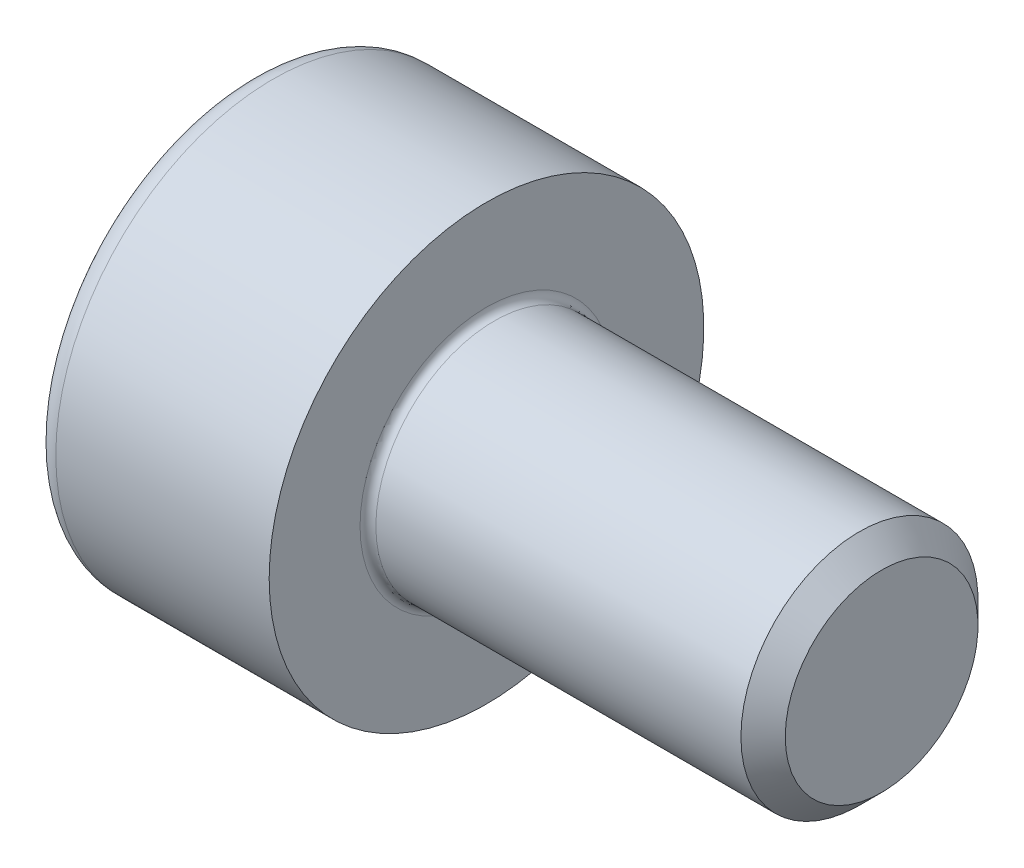
ISO-10303-21;
HEADER;
FILE_DESCRIPTION(('STEP AP214'),'2;1');
FILE_NAME('part.step','',(''),(''),'','','');
FILE_SCHEMA(('AUTOMOTIVE_DESIGN { 1 0 10303 214 1 1 1 1 }'));
ENDSEC;
DATA;
#1=APPLICATION_CONTEXT('core data for automotive mechanical design processes');
#2=APPLICATION_PROTOCOL_DEFINITION('international standard','automotive_design',2000,#1);
#3=PRODUCT_CONTEXT('',#1,'mechanical');
#4=PRODUCT('Part','Part','',(#3));
#5=PRODUCT_RELATED_PRODUCT_CATEGORY('part','',(#4));
#6=PRODUCT_DEFINITION_FORMATION('','',#4);
#7=PRODUCT_DEFINITION_CONTEXT('part definition',#1,'design');
#8=PRODUCT_DEFINITION('design','',#6,#7);
#9=PRODUCT_DEFINITION_SHAPE('','',#8);
#10=(LENGTH_UNIT() NAMED_UNIT(*) SI_UNIT(.MILLI.,.METRE.));
#11=(NAMED_UNIT(*) PLANE_ANGLE_UNIT() SI_UNIT($,.RADIAN.));
#12=(NAMED_UNIT(*) SI_UNIT($,.STERADIAN.) SOLID_ANGLE_UNIT());
#13=UNCERTAINTY_MEASURE_WITH_UNIT(LENGTH_MEASURE(1.E-05),#10,'distance_accuracy_value','');
#14=(GEOMETRIC_REPRESENTATION_CONTEXT(3) GLOBAL_UNCERTAINTY_ASSIGNED_CONTEXT((#13)) GLOBAL_UNIT_ASSIGNED_CONTEXT((#10,
#11,#12)) REPRESENTATION_CONTEXT('',''));
#15=CARTESIAN_POINT('',(0.,0.,0.));
#16=DIRECTION('',(0.,0.,1.));
#17=DIRECTION('',(1.,0.,0.));
#18=AXIS2_PLACEMENT_3D('',#15,#16,#17);
#19=CARTESIAN_POINT('',(8.,1.2195,0.));
#20=DIRECTION('',(1.,0.,0.));
#21=DIRECTION('',(0.,0.,-1.));
#22=AXIS2_PLACEMENT_3D('',#19,#20,#21);
#23=PLANE('',#22);
#24=CARTESIAN_POINT('',(7.99999999998136,0.,0.));
#25=DIRECTION('',(-1.,0.,0.));
#26=DIRECTION('',(0.,0.,1.));
#27=AXIS2_PLACEMENT_3D('',#24,#25,#26);
#28=CIRCLE('',#27,1.21950000004745);
#29=CARTESIAN_POINT('',(7.99999999998136,0.,1.21950000004745));
#30=VERTEX_POINT('',#29);
#31=EDGE_CURVE('E107',#30,#30,#28,.T.);
#32=ORIENTED_EDGE('',*,*,#31,.F.);
#33=EDGE_LOOP('',(#32));
#34=FACE_BOUND('',#33,.T.);
#35=ADVANCED_FACE('F16',(#34),#23,.T.);
#36=CARTESIAN_POINT('',(1.30000000012842,0.,0.));
#37=DIRECTION('',(-1.,0.,0.));
#38=DIRECTION('',(0.,0.,1.));
#39=AXIS2_PLACEMENT_3D('',#36,#37,#38);
#40=CONICAL_SURFACE('',#39,1.25999999988835,1.04719755097185);
#41=CARTESIAN_POINT('',(2.02746133933829,0.,2.27373675443232E-10));
#42=VERTEX_POINT('',#41);
#43=VERTEX_LOOP('',#42);
#44=FACE_BOUND('',#43,.T.);
#45=CARTESIAN_POINT('',(1.30000000002996,0.,0.));
#46=DIRECTION('',(-1.,0.,0.));
#47=DIRECTION('',(0.,0.,1.));
#48=AXIS2_PLACEMENT_3D('',#45,#46,#47);
#49=CIRCLE('',#48,1.26000000005888);
#50=CARTESIAN_POINT('',(1.30000000001498,-1.09119200879389,0.630000000014723));
#51=VERTEX_POINT('',#50);
#52=CARTESIAN_POINT('',(1.30000000001498,0.,1.26000000002944));
#53=VERTEX_POINT('',#52);
#54=EDGE_CURVE('E96',#51,#53,#49,.T.);
#55=ORIENTED_EDGE('',*,*,#54,.T.);
#56=CARTESIAN_POINT('',(1.30000000002996,0.,0.));
#57=DIRECTION('',(-1.,0.,0.));
#58=DIRECTION('',(0.,0.,1.));
#59=AXIS2_PLACEMENT_3D('',#56,#57,#58);
#60=CIRCLE('',#59,1.26000000005888);
#61=CARTESIAN_POINT('',(1.30000000001498,1.09119200879389,0.63000000001472));
#62=VERTEX_POINT('',#61);
#63=EDGE_CURVE('E99',#53,#62,#60,.T.);
#64=ORIENTED_EDGE('',*,*,#63,.T.);
#65=CARTESIAN_POINT('',(1.30000000002996,0.,0.));
#66=DIRECTION('',(-1.,0.,0.));
#67=DIRECTION('',(0.,0.,1.));
#68=AXIS2_PLACEMENT_3D('',#65,#66,#67);
#69=CIRCLE('',#68,1.26000000005888);
#70=CARTESIAN_POINT('',(1.30000000001498,1.09119200879389,-0.630000000014721));
#71=VERTEX_POINT('',#70);
#72=EDGE_CURVE('E102',#62,#71,#69,.T.);
#73=ORIENTED_EDGE('',*,*,#72,.T.);
#74=CARTESIAN_POINT('',(1.30000000002996,0.,0.));
#75=DIRECTION('',(-1.,0.,0.));
#76=DIRECTION('',(0.,0.,1.));
#77=AXIS2_PLACEMENT_3D('',#74,#75,#76);
#78=CIRCLE('',#77,1.26000000005888);
#79=CARTESIAN_POINT('',(1.30000000001498,0.,-1.26000000002944));
#80=VERTEX_POINT('',#79);
#81=EDGE_CURVE('E117',#71,#80,#78,.T.);
#82=ORIENTED_EDGE('',*,*,#81,.T.);
#83=CARTESIAN_POINT('',(1.30000000002996,0.,0.));
#84=DIRECTION('',(-1.,0.,0.));
#85=DIRECTION('',(0.,0.,1.));
#86=AXIS2_PLACEMENT_3D('',#83,#84,#85);
#87=CIRCLE('',#86,1.26000000005888);
#88=CARTESIAN_POINT('',(1.30000000001498,-1.09119200879389,-0.630000000014722));
#89=VERTEX_POINT('',#88);
#90=EDGE_CURVE('E118',#80,#89,#87,.T.);
#91=ORIENTED_EDGE('',*,*,#90,.T.);
#92=CARTESIAN_POINT('',(1.30000000002996,0.,0.));
#93=DIRECTION('',(-1.,0.,0.));
#94=DIRECTION('',(0.,0.,1.));
#95=AXIS2_PLACEMENT_3D('',#92,#93,#94);
#96=CIRCLE('',#95,1.26000000005888);
#97=EDGE_CURVE('E225',#89,#51,#96,.T.);
#98=ORIENTED_EDGE('',*,*,#97,.T.);
#99=EDGE_LOOP('',(#55,#64,#73,#82,#91,#98));
#100=FACE_BOUND('',#99,.T.);
#101=ADVANCED_FACE('F101',(#44,#100),#40,.F.);
#102=CARTESIAN_POINT('',(7.71950000006427,0.,0.));
#103=DIRECTION('',(-1.,0.,0.));
#104=DIRECTION('',(0.,0.,1.));
#105=AXIS2_PLACEMENT_3D('',#102,#103,#104);
#106=CONICAL_SURFACE('',#105,1.49999999996453,0.785398163397448);
#107=CARTESIAN_POINT('',(7.7195,0.,0.));
#108=DIRECTION('',(-1.,0.,0.));
#109=DIRECTION('',(0.,0.,1.));
#110=AXIS2_PLACEMENT_3D('',#107,#108,#109);
#111=CIRCLE('',#110,1.5);
#112=CARTESIAN_POINT('',(7.7195,0.,1.5));
#113=VERTEX_POINT('',#112);
#114=EDGE_CURVE('E132',#113,#113,#111,.T.);
#115=ORIENTED_EDGE('',*,*,#114,.F.);
#116=EDGE_LOOP('',(#115));
#117=FACE_BOUND('',#116,.T.);
#118=ORIENTED_EDGE('',*,*,#31,.T.);
#119=EDGE_LOOP('',(#118));
#120=FACE_BOUND('',#119,.T.);
#121=ADVANCED_FACE('F515',(#117,#120),#106,.T.);
#122=CARTESIAN_POINT('',(1.3,1.45492267835785,0.));
#123=DIRECTION('',(1.,0.,0.));
#124=DIRECTION('',(0.,0.,-1.));
#125=AXIS2_PLACEMENT_3D('',#122,#123,#124);
#126=PLANE('',#125);
#127=DIRECTION('',(0.,0.5,-0.866025403784439));
#128=VECTOR('',#127,1.);
#129=CARTESIAN_POINT('',(1.3,1.45492267835785,0.));
#130=LINE('',#129,#128);
#131=CARTESIAN_POINT('',(1.3,0.727461339178924,1.26));
#132=VERTEX_POINT('',#131);
#133=EDGE_CURVE('E121',#62,#132,#130,.F.);
#134=ORIENTED_EDGE('',*,*,#133,.F.);
#135=ORIENTED_EDGE('',*,*,#63,.F.);
#136=DIRECTION('',(0.,-1.,0.));
#137=VECTOR('',#136,1.);
#138=CARTESIAN_POINT('',(1.3,-0.727461339178934,1.26));
#139=LINE('',#138,#137);
#140=EDGE_CURVE('E123',#53,#132,#139,.F.);
#141=ORIENTED_EDGE('',*,*,#140,.T.);
#142=EDGE_LOOP('',(#134,#135,#141));
#143=FACE_BOUND('',#142,.T.);
#144=ADVANCED_FACE('F122',(#143),#126,.F.);
#145=CARTESIAN_POINT('',(1.3,1.45492267835785,0.));
#146=DIRECTION('',(1.,0.,0.));
#147=DIRECTION('',(0.,0.,-1.));
#148=AXIS2_PLACEMENT_3D('',#145,#146,#147);
#149=PLANE('',#148);
#150=DIRECTION('',(0.,-1.,0.));
#151=VECTOR('',#150,1.);
#152=CARTESIAN_POINT('',(1.3,-0.727461339178934,1.26));
#153=LINE('',#152,#151);
#154=CARTESIAN_POINT('',(1.3,-0.727461339178934,1.26));
#155=VERTEX_POINT('',#154);
#156=EDGE_CURVE('E127',#155,#53,#153,.F.);
#157=ORIENTED_EDGE('',*,*,#156,.T.);
#158=ORIENTED_EDGE('',*,*,#54,.F.);
#159=DIRECTION('',(0.,0.500000000000001,0.866025403784438));
#160=VECTOR('',#159,1.);
#161=CARTESIAN_POINT('',(1.3,-0.727461339178934,1.26));
#162=LINE('',#161,#160);
#163=EDGE_CURVE('E182',#155,#51,#162,.F.);
#164=ORIENTED_EDGE('',*,*,#163,.F.);
#165=EDGE_LOOP('',(#157,#158,#164));
#166=FACE_BOUND('',#165,.T.);
#167=ADVANCED_FACE('F371',(#166),#149,.F.);
#168=CARTESIAN_POINT('',(1.3,1.45492267835785,0.));
#169=DIRECTION('',(1.,0.,0.));
#170=DIRECTION('',(0.,0.,-1.));
#171=AXIS2_PLACEMENT_3D('',#168,#169,#170);
#172=PLANE('',#171);
#173=DIRECTION('',(0.,0.500000000000001,0.866025403784438));
#174=VECTOR('',#173,1.);
#175=CARTESIAN_POINT('',(1.3,-0.727461339178934,1.26));
#176=LINE('',#175,#174);
#177=CARTESIAN_POINT('',(1.3,-1.45492267835786,0.));
#178=VERTEX_POINT('',#177);
#179=EDGE_CURVE('E178',#51,#178,#176,.F.);
#180=ORIENTED_EDGE('',*,*,#179,.F.);
#181=ORIENTED_EDGE('',*,*,#97,.F.);
#182=DIRECTION('',(0.,-0.5,0.866025403784439));
#183=VECTOR('',#182,1.);
#184=CARTESIAN_POINT('',(1.3,-1.45492267835786,0.));
#185=LINE('',#184,#183);
#186=EDGE_CURVE('E164',#178,#89,#185,.F.);
#187=ORIENTED_EDGE('',*,*,#186,.F.);
#188=EDGE_LOOP('',(#180,#181,#187));
#189=FACE_BOUND('',#188,.T.);
#190=ADVANCED_FACE('F366',(#189),#172,.F.);
#191=CARTESIAN_POINT('',(1.3,1.45492267835785,0.));
#192=DIRECTION('',(1.,0.,0.));
#193=DIRECTION('',(0.,0.,-1.));
#194=AXIS2_PLACEMENT_3D('',#191,#192,#193);
#195=PLANE('',#194);
#196=DIRECTION('',(0.,-0.5,0.866025403784439));
#197=VECTOR('',#196,1.);
#198=CARTESIAN_POINT('',(1.3,-1.45492267835786,0.));
#199=LINE('',#198,#197);
#200=CARTESIAN_POINT('',(1.3,-0.727461339178936,-1.26));
#201=VERTEX_POINT('',#200);
#202=EDGE_CURVE('E161',#89,#201,#199,.F.);
#203=ORIENTED_EDGE('',*,*,#202,.F.);
#204=ORIENTED_EDGE('',*,*,#90,.F.);
#205=DIRECTION('',(0.,1.,0.));
#206=VECTOR('',#205,1.);
#207=CARTESIAN_POINT('',(1.3,0.727461339178922,-1.26));
#208=LINE('',#207,#206);
#209=EDGE_CURVE('E155',#80,#201,#208,.F.);
#210=ORIENTED_EDGE('',*,*,#209,.T.);
#211=EDGE_LOOP('',(#203,#204,#210));
#212=FACE_BOUND('',#211,.T.);
#213=ADVANCED_FACE('F361',(#212),#195,.F.);
#214=CARTESIAN_POINT('',(1.3,1.45492267835785,0.));
#215=DIRECTION('',(1.,0.,0.));
#216=DIRECTION('',(0.,0.,-1.));
#217=AXIS2_PLACEMENT_3D('',#214,#215,#216);
#218=PLANE('',#217);
#219=DIRECTION('',(0.,0.500000000000001,0.866025403784438));
#220=VECTOR('',#219,1.);
#221=CARTESIAN_POINT('',(1.3,1.45492267835785,0.));
#222=LINE('',#221,#220);
#223=CARTESIAN_POINT('',(1.3,1.45492267835785,0.));
#224=VERTEX_POINT('',#223);
#225=EDGE_CURVE('E115',#224,#71,#222,.F.);
#226=ORIENTED_EDGE('',*,*,#225,.T.);
#227=ORIENTED_EDGE('',*,*,#72,.F.);
#228=DIRECTION('',(0.,0.5,-0.866025403784439));
#229=VECTOR('',#228,1.);
#230=CARTESIAN_POINT('',(1.3,1.45492267835785,0.));
#231=LINE('',#230,#229);
#232=EDGE_CURVE('E112',#224,#62,#231,.F.);
#233=ORIENTED_EDGE('',*,*,#232,.F.);
#234=EDGE_LOOP('',(#226,#227,#233));
#235=FACE_BOUND('',#234,.T.);
#236=ADVANCED_FACE('F110',(#235),#218,.F.);
#237=CARTESIAN_POINT('',(1.3,1.45492267835785,0.));
#238=DIRECTION('',(1.,0.,0.));
#239=DIRECTION('',(0.,0.,-1.));
#240=AXIS2_PLACEMENT_3D('',#237,#238,#239);
#241=PLANE('',#240);
#242=DIRECTION('',(0.,1.,0.));
#243=VECTOR('',#242,1.);
#244=CARTESIAN_POINT('',(1.3,0.727461339178922,-1.26));
#245=LINE('',#244,#243);
#246=CARTESIAN_POINT('',(1.3,0.727461339178922,-1.26));
#247=VERTEX_POINT('',#246);
#248=EDGE_CURVE('E158',#247,#80,#245,.F.);
#249=ORIENTED_EDGE('',*,*,#248,.T.);
#250=ORIENTED_EDGE('',*,*,#81,.F.);
#251=DIRECTION('',(0.,0.500000000000001,0.866025403784438));
#252=VECTOR('',#251,1.);
#253=CARTESIAN_POINT('',(1.3,1.45492267835785,0.));
#254=LINE('',#253,#252);
#255=EDGE_CURVE('E327',#71,#247,#254,.F.);
#256=ORIENTED_EDGE('',*,*,#255,.T.);
#257=EDGE_LOOP('',(#249,#250,#256));
#258=FACE_BOUND('',#257,.T.);
#259=ADVANCED_FACE('F470',(#258),#241,.F.);
#260=CARTESIAN_POINT('',(-31.75,0.,0.));
#261=DIRECTION('',(-1.,0.,0.));
#262=DIRECTION('',(0.,0.,1.));
#263=AXIS2_PLACEMENT_3D('',#260,#261,#262);
#264=CYLINDRICAL_SURFACE('',#263,1.5);
#265=CARTESIAN_POINT('',(3.1,0.,0.));
#266=DIRECTION('',(1.,0.,0.));
#267=DIRECTION('',(0.,0.,-1.));
#268=AXIS2_PLACEMENT_3D('',#265,#266,#267);
#269=CIRCLE('',#268,1.5);
#270=CARTESIAN_POINT('',(3.1,0.,-1.5));
#271=VERTEX_POINT('',#270);
#272=EDGE_CURVE('E146',#271,#271,#269,.T.);
#273=ORIENTED_EDGE('',*,*,#272,.T.);
#274=EDGE_LOOP('',(#273));
#275=FACE_BOUND('',#274,.T.);
#276=ORIENTED_EDGE('',*,*,#114,.T.);
#277=EDGE_LOOP('',(#276));
#278=FACE_BOUND('',#277,.T.);
#279=ADVANCED_FACE('F383',(#275,#278),#264,.T.);
#280=CARTESIAN_POINT('',(1.3,1.45492267835785,0.));
#281=DIRECTION('',(0.,-0.866025403784439,-0.5));
#282=DIRECTION('',(0.,0.5,-0.866025403784439));
#283=AXIS2_PLACEMENT_3D('',#280,#281,#282);
#284=PLANE('',#283);
#285=ORIENTED_EDGE('',*,*,#133,.T.);
#286=DIRECTION('',(1.,0.,0.));
#287=VECTOR('',#286,1.);
#288=CARTESIAN_POINT('',(1.3,0.727461339178924,1.26));
#289=LINE('',#288,#287);
#290=CARTESIAN_POINT('',(0.,0.727461339178924,1.26));
#291=VERTEX_POINT('',#290);
#292=EDGE_CURVE('E202',#132,#291,#289,.F.);
#293=ORIENTED_EDGE('',*,*,#292,.T.);
#294=DIRECTION('',(0.,-0.5,0.866025403784438));
#295=VECTOR('',#294,1.);
#296=CARTESIAN_POINT('',(0.,1.45492267835785,0.));
#297=LINE('',#296,#295);
#298=CARTESIAN_POINT('',(0.,1.45492267835785,0.));
#299=VERTEX_POINT('',#298);
#300=EDGE_CURVE('E142',#299,#291,#297,.T.);
#301=ORIENTED_EDGE('',*,*,#300,.F.);
#302=DIRECTION('',(1.,0.,0.));
#303=VECTOR('',#302,1.);
#304=CARTESIAN_POINT('',(1.3,1.45492267835785,0.));
#305=LINE('',#304,#303);
#306=EDGE_CURVE('E131',#299,#224,#305,.T.);
#307=ORIENTED_EDGE('',*,*,#306,.T.);
#308=ORIENTED_EDGE('',*,*,#232,.T.);
#309=EDGE_LOOP('',(#285,#293,#301,#307,#308));
#310=FACE_BOUND('',#309,.T.);
#311=ADVANCED_FACE('F129',(#310),#284,.T.);
#312=CARTESIAN_POINT('',(1.3,-0.727461339178934,1.26));
#313=DIRECTION('',(0.,0.,1.));
#314=DIRECTION('',(0.,-1.,0.));
#315=AXIS2_PLACEMENT_3D('',#312,#313,#314);
#316=PLANE('',#315);
#317=ORIENTED_EDGE('',*,*,#292,.F.);
#318=ORIENTED_EDGE('',*,*,#140,.F.);
#319=ORIENTED_EDGE('',*,*,#156,.F.);
#320=DIRECTION('',(1.,0.,0.));
#321=VECTOR('',#320,1.);
#322=CARTESIAN_POINT('',(1.3,-0.727461339178934,1.26));
#323=LINE('',#322,#321);
#324=CARTESIAN_POINT('',(0.,-0.727461339178934,1.26));
#325=VERTEX_POINT('',#324);
#326=EDGE_CURVE('E197',#325,#155,#323,.T.);
#327=ORIENTED_EDGE('',*,*,#326,.F.);
#328=DIRECTION('',(0.,1.,0.));
#329=VECTOR('',#328,1.);
#330=CARTESIAN_POINT('',(0.,0.,1.26));
#331=LINE('',#330,#329);
#332=EDGE_CURVE('E145',#291,#325,#331,.F.);
#333=ORIENTED_EDGE('',*,*,#332,.F.);
#334=EDGE_LOOP('',(#317,#318,#319,#327,#333));
#335=FACE_BOUND('',#334,.T.);
#336=ADVANCED_FACE('F373',(#335),#316,.F.);
#337=CARTESIAN_POINT('',(1.3,-0.727461339178934,1.26));
#338=DIRECTION('',(0.,0.866025403784438,-0.500000000000001));
#339=DIRECTION('',(0.,0.500000000000001,0.866025403784438));
#340=AXIS2_PLACEMENT_3D('',#337,#338,#339);
#341=PLANE('',#340);
#342=ORIENTED_EDGE('',*,*,#179,.T.);
#343=DIRECTION('',(1.,0.,0.));
#344=VECTOR('',#343,1.);
#345=CARTESIAN_POINT('',(1.3,-1.45492267835786,0.));
#346=LINE('',#345,#344);
#347=CARTESIAN_POINT('',(0.,-1.45492267835786,0.));
#348=VERTEX_POINT('',#347);
#349=EDGE_CURVE('E173',#348,#178,#346,.T.);
#350=ORIENTED_EDGE('',*,*,#349,.F.);
#351=DIRECTION('',(0.,-0.500000000000001,-0.866025403784438));
#352=VECTOR('',#351,1.);
#353=CARTESIAN_POINT('',(0.,-0.727461339178934,1.26));
#354=LINE('',#353,#352);
#355=EDGE_CURVE('E188',#325,#348,#354,.T.);
#356=ORIENTED_EDGE('',*,*,#355,.F.);
#357=ORIENTED_EDGE('',*,*,#326,.T.);
#358=ORIENTED_EDGE('',*,*,#163,.T.);
#359=EDGE_LOOP('',(#342,#350,#356,#357,#358));
#360=FACE_BOUND('',#359,.T.);
#361=ADVANCED_FACE('F369',(#360),#341,.T.);
#362=CARTESIAN_POINT('',(1.3,-1.45492267835786,0.));
#363=DIRECTION('',(0.,0.866025403784439,0.5));
#364=DIRECTION('',(0.,-0.5,0.866025403784439));
#365=AXIS2_PLACEMENT_3D('',#362,#363,#364);
#366=PLANE('',#365);
#367=ORIENTED_EDGE('',*,*,#202,.T.);
#368=DIRECTION('',(1.,0.,0.));
#369=VECTOR('',#368,1.);
#370=CARTESIAN_POINT('',(1.3,-0.727461339178936,-1.26));
#371=LINE('',#370,#369);
#372=CARTESIAN_POINT('',(0.,-0.727461339178936,-1.26));
#373=VERTEX_POINT('',#372);
#374=EDGE_CURVE('E157',#201,#373,#371,.F.);
#375=ORIENTED_EDGE('',*,*,#374,.T.);
#376=DIRECTION('',(0.,0.5,-0.866025403784439));
#377=VECTOR('',#376,1.);
#378=CARTESIAN_POINT('',(0.,-1.45492267835786,0.));
#379=LINE('',#378,#377);
#380=EDGE_CURVE('E185',#348,#373,#379,.T.);
#381=ORIENTED_EDGE('',*,*,#380,.F.);
#382=ORIENTED_EDGE('',*,*,#349,.T.);
#383=ORIENTED_EDGE('',*,*,#186,.T.);
#384=EDGE_LOOP('',(#367,#375,#381,#382,#383));
#385=FACE_BOUND('',#384,.T.);
#386=ADVANCED_FACE('F357',(#385),#366,.T.);
#387=CARTESIAN_POINT('',(1.3,0.727461339178922,-1.26));
#388=DIRECTION('',(0.,0.,-1.));
#389=DIRECTION('',(0.,1.,0.));
#390=AXIS2_PLACEMENT_3D('',#387,#388,#389);
#391=PLANE('',#390);
#392=ORIENTED_EDGE('',*,*,#374,.F.);
#393=ORIENTED_EDGE('',*,*,#209,.F.);
#394=ORIENTED_EDGE('',*,*,#248,.F.);
#395=DIRECTION('',(1.,0.,0.));
#396=VECTOR('',#395,1.);
#397=CARTESIAN_POINT('',(1.3,0.727461339178922,-1.26));
#398=LINE('',#397,#396);
#399=CARTESIAN_POINT('',(0.,0.727461339178923,-1.26));
#400=VERTEX_POINT('',#399);
#401=EDGE_CURVE('E325',#247,#400,#398,.F.);
#402=ORIENTED_EDGE('',*,*,#401,.T.);
#403=DIRECTION('',(0.,1.,0.));
#404=VECTOR('',#403,1.);
#405=CARTESIAN_POINT('',(0.,0.,-1.26));
#406=LINE('',#405,#404);
#407=EDGE_CURVE('E152',#373,#400,#406,.T.);
#408=ORIENTED_EDGE('',*,*,#407,.F.);
#409=EDGE_LOOP('',(#392,#393,#394,#402,#408));
#410=FACE_BOUND('',#409,.T.);
#411=ADVANCED_FACE('F346',(#410),#391,.F.);
#412=CARTESIAN_POINT('',(1.3,1.45492267835785,0.));
#413=DIRECTION('',(0.,0.866025403784438,-0.500000000000001));
#414=DIRECTION('',(0.,0.500000000000001,0.866025403784438));
#415=AXIS2_PLACEMENT_3D('',#412,#413,#414);
#416=PLANE('',#415);
#417=ORIENTED_EDGE('',*,*,#401,.F.);
#418=ORIENTED_EDGE('',*,*,#255,.F.);
#419=ORIENTED_EDGE('',*,*,#225,.F.);
#420=ORIENTED_EDGE('',*,*,#306,.F.);
#421=DIRECTION('',(0.,0.500000000000001,0.866025403784438));
#422=VECTOR('',#421,1.);
#423=CARTESIAN_POINT('',(0.,0.727461339178922,-1.26));
#424=LINE('',#423,#422);
#425=EDGE_CURVE('E149',#400,#299,#424,.T.);
#426=ORIENTED_EDGE('',*,*,#425,.F.);
#427=EDGE_LOOP('',(#417,#418,#419,#420,#426));
#428=FACE_BOUND('',#427,.T.);
#429=ADVANCED_FACE('F351',(#428),#416,.F.);
#430=CARTESIAN_POINT('',(3.1,0.,0.));
#431=DIRECTION('',(1.,0.,0.));
#432=DIRECTION('',(0.,0.,-1.));
#433=AXIS2_PLACEMENT_3D('',#430,#431,#432);
#434=TOROIDAL_SURFACE('',#433,1.6,0.1);
#435=ORIENTED_EDGE('',*,*,#272,.F.);
#436=EDGE_LOOP('',(#435));
#437=FACE_BOUND('',#436,.T.);
#438=CARTESIAN_POINT('',(3.,0.,0.));
#439=DIRECTION('',(1.,0.,0.));
#440=DIRECTION('',(0.,0.,1.));
#441=AXIS2_PLACEMENT_3D('',#438,#439,#440);
#442=CIRCLE('',#441,1.6);
#443=CARTESIAN_POINT('',(3.,0.,-1.6));
#444=VERTEX_POINT('',#443);
#445=CARTESIAN_POINT('',(3.,0.,1.6));
#446=VERTEX_POINT('',#445);
#447=EDGE_CURVE('E258',#444,#446,#442,.F.);
#448=ORIENTED_EDGE('',*,*,#447,.F.);
#449=CARTESIAN_POINT('',(3.,0.,0.));
#450=DIRECTION('',(1.,0.,0.));
#451=DIRECTION('',(0.,0.,-1.));
#452=AXIS2_PLACEMENT_3D('',#449,#450,#451);
#453=CIRCLE('',#452,1.6);
#454=EDGE_CURVE('E268',#446,#444,#453,.F.);
#455=ORIENTED_EDGE('',*,*,#454,.F.);
#456=EDGE_LOOP('',(#448,#455));
#457=FACE_BOUND('',#456,.T.);
#458=ADVANCED_FACE('F289',(#437,#457),#434,.F.);
#459=CARTESIAN_POINT('',(0.,0.,0.));
#460=DIRECTION('',(-1.,0.,0.));
#461=DIRECTION('',(0.,0.,1.));
#462=AXIS2_PLACEMENT_3D('',#459,#460,#461);
#463=PLANE('',#462);
#464=CARTESIAN_POINT('',(0.,0.,0.));
#465=DIRECTION('',(1.,0.,0.));
#466=DIRECTION('',(0.,0.,-1.));
#467=AXIS2_PLACEMENT_3D('',#464,#465,#466);
#468=CIRCLE('',#467,2.45);
#469=CARTESIAN_POINT('',(0.,0.,-2.45));
#470=VERTEX_POINT('',#469);
#471=CARTESIAN_POINT('',(0.,0.,2.45));
#472=VERTEX_POINT('',#471);
#473=EDGE_CURVE('E222',#470,#472,#468,.T.);
#474=ORIENTED_EDGE('',*,*,#473,.F.);
#475=CARTESIAN_POINT('',(0.,0.,0.));
#476=DIRECTION('',(1.,0.,0.));
#477=DIRECTION('',(0.,0.,1.));
#478=AXIS2_PLACEMENT_3D('',#475,#476,#477);
#479=CIRCLE('',#478,2.45);
#480=EDGE_CURVE('E35',#472,#470,#479,.T.);
#481=ORIENTED_EDGE('',*,*,#480,.F.);
#482=EDGE_LOOP('',(#474,#481));
#483=FACE_BOUND('',#482,.T.);
#484=ORIENTED_EDGE('',*,*,#407,.T.);
#485=ORIENTED_EDGE('',*,*,#425,.T.);
#486=ORIENTED_EDGE('',*,*,#300,.T.);
#487=ORIENTED_EDGE('',*,*,#332,.T.);
#488=ORIENTED_EDGE('',*,*,#355,.T.);
#489=ORIENTED_EDGE('',*,*,#380,.T.);
#490=EDGE_LOOP('',(#484,#485,#486,#487,#488,#489));
#491=FACE_BOUND('',#490,.T.);
#492=ADVANCED_FACE('F281',(#483,#491),#463,.T.);
#493=CARTESIAN_POINT('',(3.,2.75,0.));
#494=DIRECTION('',(1.,0.,0.));
#495=DIRECTION('',(0.,0.,-1.));
#496=AXIS2_PLACEMENT_3D('',#493,#494,#495);
#497=PLANE('',#496);
#498=CARTESIAN_POINT('',(3.,0.,0.));
#499=DIRECTION('',(-1.,0.,0.));
#500=DIRECTION('',(0.,0.,1.));
#501=AXIS2_PLACEMENT_3D('',#498,#499,#500);
#502=CIRCLE('',#501,2.75);
#503=CARTESIAN_POINT('',(3.,0.,2.75));
#504=VERTEX_POINT('',#503);
#505=EDGE_CURVE('E27',#504,#504,#502,.T.);
#506=ORIENTED_EDGE('',*,*,#505,.F.);
#507=EDGE_LOOP('',(#506));
#508=FACE_BOUND('',#507,.T.);
#509=ORIENTED_EDGE('',*,*,#447,.T.);
#510=ORIENTED_EDGE('',*,*,#454,.T.);
#511=EDGE_LOOP('',(#509,#510));
#512=FACE_BOUND('',#511,.T.);
#513=ADVANCED_FACE('F247',(#508,#512),#497,.T.);
#514=CARTESIAN_POINT('',(0.300000000000002,0.,0.));
#515=DIRECTION('',(-1.,0.,0.));
#516=DIRECTION('',(0.,0.,1.));
#517=AXIS2_PLACEMENT_3D('',#514,#515,#516);
#518=TOROIDAL_SURFACE('',#517,2.45,0.3);
#519=ORIENTED_EDGE('',*,*,#480,.T.);
#520=ORIENTED_EDGE('',*,*,#473,.T.);
#521=EDGE_LOOP('',(#519,#520));
#522=FACE_BOUND('',#521,.T.);
#523=CARTESIAN_POINT('',(0.300000000000002,0.,0.));
#524=DIRECTION('',(-1.,0.,0.));
#525=DIRECTION('',(0.,0.,1.));
#526=AXIS2_PLACEMENT_3D('',#523,#524,#525);
#527=CIRCLE('',#526,2.75);
#528=CARTESIAN_POINT('',(0.300000000000002,0.,2.75));
#529=VERTEX_POINT('',#528);
#530=EDGE_CURVE('E11',#529,#529,#527,.F.);
#531=ORIENTED_EDGE('',*,*,#530,.F.);
#532=EDGE_LOOP('',(#531));
#533=FACE_BOUND('',#532,.T.);
#534=ADVANCED_FACE('F235',(#522,#533),#518,.T.);
#535=CARTESIAN_POINT('',(-31.75,0.,0.));
#536=DIRECTION('',(-1.,0.,0.));
#537=DIRECTION('',(0.,0.,1.));
#538=AXIS2_PLACEMENT_3D('',#535,#536,#537);
#539=CYLINDRICAL_SURFACE('',#538,2.75);
#540=ORIENTED_EDGE('',*,*,#530,.T.);
#541=EDGE_LOOP('',(#540));
#542=FACE_BOUND('',#541,.T.);
#543=ORIENTED_EDGE('',*,*,#505,.T.);
#544=EDGE_LOOP('',(#543));
#545=FACE_BOUND('',#544,.T.);
#546=ADVANCED_FACE('F246',(#542,#545),#539,.T.);
#547=CLOSED_SHELL('',(#35,#101,#121,#144,#167,#190,#213,#236,#259,#279,#311,#336,#361,#386,#411,
#429,#458,#492,#513,#534,#546));
#548=MANIFOLD_SOLID_BREP('B1',#547);
#549=ADVANCED_BREP_SHAPE_REPRESENTATION('',(#18,#548),#14);
#550=SHAPE_DEFINITION_REPRESENTATION(#9,#549);
ENDSEC;
END-ISO-10303-21;
